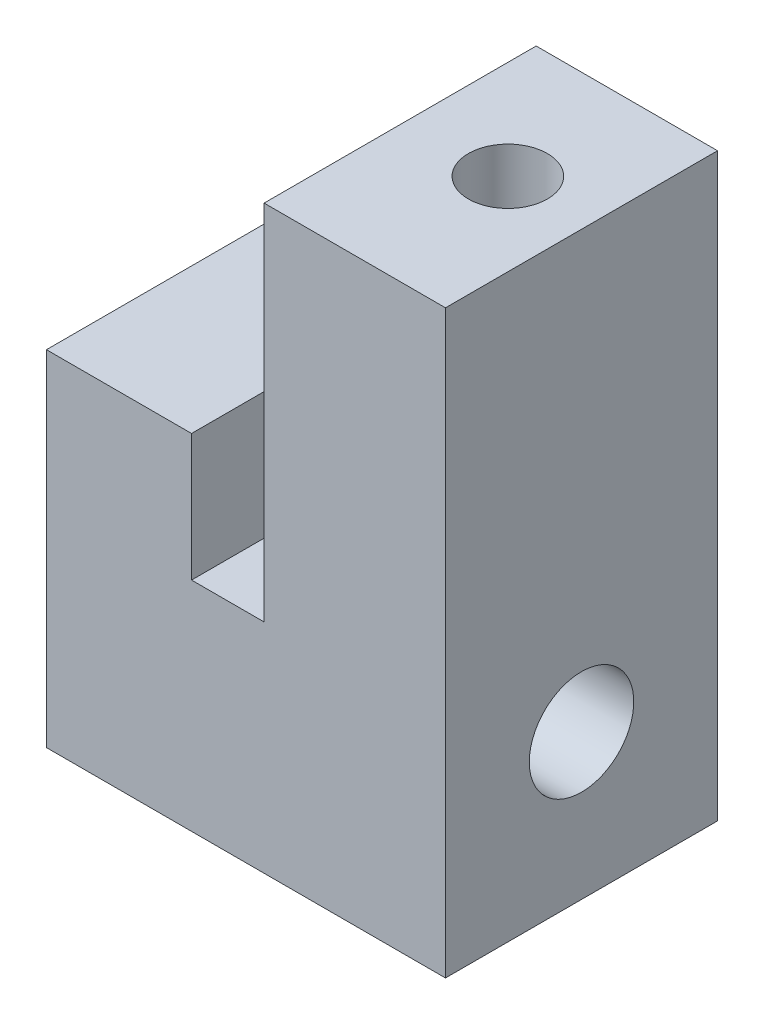
ISO-10303-21;
HEADER;
FILE_DESCRIPTION(('STEP AP214'),'2;1');
FILE_NAME('part.step','',(''),(''),'','','');
FILE_SCHEMA(('AUTOMOTIVE_DESIGN { 1 0 10303 214 1 1 1 1 }'));
ENDSEC;
DATA;
#1=APPLICATION_CONTEXT('core data for automotive mechanical design processes');
#2=APPLICATION_PROTOCOL_DEFINITION('international standard','automotive_design',2000,#1);
#3=PRODUCT_CONTEXT('',#1,'mechanical');
#4=PRODUCT('Part','Part','',(#3));
#5=PRODUCT_RELATED_PRODUCT_CATEGORY('part','',(#4));
#6=PRODUCT_DEFINITION_FORMATION('','',#4);
#7=PRODUCT_DEFINITION_CONTEXT('part definition',#1,'design');
#8=PRODUCT_DEFINITION('design','',#6,#7);
#9=PRODUCT_DEFINITION_SHAPE('','',#8);
#10=(LENGTH_UNIT() NAMED_UNIT(*) SI_UNIT(.MILLI.,.METRE.));
#11=(NAMED_UNIT(*) PLANE_ANGLE_UNIT() SI_UNIT($,.RADIAN.));
#12=(NAMED_UNIT(*) SI_UNIT($,.STERADIAN.) SOLID_ANGLE_UNIT());
#13=UNCERTAINTY_MEASURE_WITH_UNIT(LENGTH_MEASURE(1.E-05),#10,'distance_accuracy_value','');
#14=(GEOMETRIC_REPRESENTATION_CONTEXT(3) GLOBAL_UNCERTAINTY_ASSIGNED_CONTEXT((#13)) GLOBAL_UNIT_ASSIGNED_CONTEXT((#10,
#11,#12)) REPRESENTATION_CONTEXT('',''));
#15=CARTESIAN_POINT('',(0.,0.,0.));
#16=DIRECTION('',(0.,0.,1.));
#17=DIRECTION('',(1.,0.,0.));
#18=AXIS2_PLACEMENT_3D('',#15,#16,#17);
#19=CARTESIAN_POINT('',(0.,25.4,0.));
#20=DIRECTION('',(1.,0.,0.));
#21=DIRECTION('',(0.,0.,-1.));
#22=AXIS2_PLACEMENT_3D('',#19,#20,#21);
#23=PLANE('',#22);
#24=CARTESIAN_POINT('',(0.,6.35,-5.953125));
#25=DIRECTION('',(-1.,0.,0.));
#26=DIRECTION('',(0.,0.,1.));
#27=AXIS2_PLACEMENT_3D('',#24,#25,#26);
#28=CIRCLE('',#27,2.286);
#29=CARTESIAN_POINT('',(0.,6.35,-3.667125));
#30=VERTEX_POINT('',#29);
#31=EDGE_CURVE('E182',#30,#30,#28,.T.);
#32=ORIENTED_EDGE('',*,*,#31,.F.);
#33=EDGE_LOOP('',(#32));
#34=FACE_BOUND('',#33,.T.);
#35=DIRECTION('',(0.,-1.,0.));
#36=VECTOR('',#35,1.);
#37=CARTESIAN_POINT('',(0.,25.4,0.));
#38=LINE('',#37,#36);
#39=CARTESIAN_POINT('',(0.,15.08125,0.));
#40=VERTEX_POINT('',#39);
#41=CARTESIAN_POINT('',(0.,0.,0.));
#42=VERTEX_POINT('',#41);
#43=EDGE_CURVE('E117',#40,#42,#38,.T.);
#44=ORIENTED_EDGE('',*,*,#43,.F.);
#45=DIRECTION('',(0.,0.,1.));
#46=VECTOR('',#45,1.);
#47=CARTESIAN_POINT('',(0.,15.08125,-25.4));
#48=LINE('',#47,#46);
#49=CARTESIAN_POINT('',(0.,15.08125,-11.90625));
#50=VERTEX_POINT('',#49);
#51=EDGE_CURVE('E86',#50,#40,#48,.T.);
#52=ORIENTED_EDGE('',*,*,#51,.F.);
#53=DIRECTION('',(0.,-1.,0.));
#54=VECTOR('',#53,1.);
#55=CARTESIAN_POINT('',(0.,25.4,-11.90625));
#56=LINE('',#55,#54);
#57=CARTESIAN_POINT('',(0.,0.,-11.90625));
#58=VERTEX_POINT('',#57);
#59=EDGE_CURVE('E79',#50,#58,#56,.T.);
#60=ORIENTED_EDGE('',*,*,#59,.T.);
#61=DIRECTION('',(0.,0.,1.));
#62=VECTOR('',#61,1.);
#63=CARTESIAN_POINT('',(0.,0.,0.));
#64=LINE('',#63,#62);
#65=EDGE_CURVE('E83',#58,#42,#64,.T.);
#66=ORIENTED_EDGE('',*,*,#65,.T.);
#67=EDGE_LOOP('',(#44,#52,#60,#66));
#68=FACE_BOUND('',#67,.T.);
#69=ADVANCED_FACE('F35',(#34,#68),#23,.F.);
#70=CARTESIAN_POINT('',(0.,25.4,0.));
#71=DIRECTION('',(0.,0.,-1.));
#72=DIRECTION('',(-1.,0.,0.));
#73=AXIS2_PLACEMENT_3D('',#70,#71,#72);
#74=PLANE('',#73);
#75=DIRECTION('',(0.,-1.,0.));
#76=VECTOR('',#75,1.);
#77=CARTESIAN_POINT('',(6.35,0.,0.));
#78=LINE('',#77,#76);
#79=CARTESIAN_POINT('',(6.35,15.08125,0.));
#80=VERTEX_POINT('',#79);
#81=CARTESIAN_POINT('',(6.35,9.525,0.));
#82=VERTEX_POINT('',#81);
#83=EDGE_CURVE('E148',#80,#82,#78,.T.);
#84=ORIENTED_EDGE('',*,*,#83,.F.);
#85=DIRECTION('',(1.,0.,0.));
#86=VECTOR('',#85,1.);
#87=CARTESIAN_POINT('',(0.,15.08125,0.));
#88=LINE('',#87,#86);
#89=EDGE_CURVE('E190',#40,#80,#88,.T.);
#90=ORIENTED_EDGE('',*,*,#89,.F.);
#91=ORIENTED_EDGE('',*,*,#43,.T.);
#92=DIRECTION('',(1.,0.,0.));
#93=VECTOR('',#92,1.);
#94=CARTESIAN_POINT('',(0.,0.,0.));
#95=LINE('',#94,#93);
#96=CARTESIAN_POINT('',(17.4625,0.,0.));
#97=VERTEX_POINT('',#96);
#98=EDGE_CURVE('E103',#42,#97,#95,.T.);
#99=ORIENTED_EDGE('',*,*,#98,.T.);
#100=DIRECTION('',(0.,-1.,0.));
#101=VECTOR('',#100,1.);
#102=CARTESIAN_POINT('',(17.4625,25.4,0.));
#103=LINE('',#102,#101);
#104=CARTESIAN_POINT('',(17.4625,25.4,0.));
#105=VERTEX_POINT('',#104);
#106=EDGE_CURVE('E114',#105,#97,#103,.T.);
#107=ORIENTED_EDGE('',*,*,#106,.F.);
#108=DIRECTION('',(1.,0.,0.));
#109=VECTOR('',#108,1.);
#110=CARTESIAN_POINT('',(0.,25.4,0.));
#111=LINE('',#110,#109);
#112=CARTESIAN_POINT('',(9.525,25.4,0.));
#113=VERTEX_POINT('',#112);
#114=EDGE_CURVE('E98',#113,#105,#111,.T.);
#115=ORIENTED_EDGE('',*,*,#114,.F.);
#116=DIRECTION('',(0.,1.,0.));
#117=VECTOR('',#116,1.);
#118=CARTESIAN_POINT('',(9.525,0.,0.));
#119=LINE('',#118,#117);
#120=CARTESIAN_POINT('',(9.525,9.525,0.));
#121=VERTEX_POINT('',#120);
#122=EDGE_CURVE('E50',#121,#113,#119,.T.);
#123=ORIENTED_EDGE('',*,*,#122,.F.);
#124=DIRECTION('',(1.,0.,0.));
#125=VECTOR('',#124,1.);
#126=CARTESIAN_POINT('',(0.,9.525,0.));
#127=LINE('',#126,#125);
#128=EDGE_CURVE('E194',#82,#121,#127,.T.);
#129=ORIENTED_EDGE('',*,*,#128,.F.);
#130=EDGE_LOOP('',(#84,#90,#91,#99,#107,#115,#123,#129));
#131=FACE_BOUND('',#130,.T.);
#132=ADVANCED_FACE('F200',(#131),#74,.F.);
#133=CARTESIAN_POINT('',(17.4625,25.4,0.));
#134=DIRECTION('',(-1.,0.,0.));
#135=DIRECTION('',(0.,0.,1.));
#136=AXIS2_PLACEMENT_3D('',#133,#134,#135);
#137=PLANE('',#136);
#138=CARTESIAN_POINT('',(17.4625,6.35,-5.953125));
#139=DIRECTION('',(-1.,0.,0.));
#140=DIRECTION('',(0.,0.,1.));
#141=AXIS2_PLACEMENT_3D('',#138,#139,#140);
#142=CIRCLE('',#141,2.286);
#143=CARTESIAN_POINT('',(17.4625,6.35,-3.667125));
#144=VERTEX_POINT('',#143);
#145=EDGE_CURVE('E38',#144,#144,#142,.T.);
#146=ORIENTED_EDGE('',*,*,#145,.T.);
#147=EDGE_LOOP('',(#146));
#148=FACE_BOUND('',#147,.T.);
#149=DIRECTION('',(0.,0.,-1.));
#150=VECTOR('',#149,1.);
#151=CARTESIAN_POINT('',(17.4625,0.,0.));
#152=LINE('',#151,#150);
#153=CARTESIAN_POINT('',(17.4625,0.,-11.90625));
#154=VERTEX_POINT('',#153);
#155=EDGE_CURVE('E99',#97,#154,#152,.T.);
#156=ORIENTED_EDGE('',*,*,#155,.T.);
#157=DIRECTION('',(0.,-1.,0.));
#158=VECTOR('',#157,1.);
#159=CARTESIAN_POINT('',(17.4625,25.4,-11.90625));
#160=LINE('',#159,#158);
#161=CARTESIAN_POINT('',(17.4625,25.4,-11.90625));
#162=VERTEX_POINT('',#161);
#163=EDGE_CURVE('E88',#162,#154,#160,.T.);
#164=ORIENTED_EDGE('',*,*,#163,.F.);
#165=DIRECTION('',(0.,0.,-1.));
#166=VECTOR('',#165,1.);
#167=CARTESIAN_POINT('',(17.4625,25.4,0.));
#168=LINE('',#167,#166);
#169=EDGE_CURVE('E59',#105,#162,#168,.T.);
#170=ORIENTED_EDGE('',*,*,#169,.F.);
#171=ORIENTED_EDGE('',*,*,#106,.T.);
#172=EDGE_LOOP('',(#156,#164,#170,#171));
#173=FACE_BOUND('',#172,.T.);
#174=ADVANCED_FACE('F203',(#148,#173),#137,.F.);
#175=CARTESIAN_POINT('',(0.,25.4,-11.90625));
#176=DIRECTION('',(0.,0.,1.));
#177=DIRECTION('',(1.,0.,0.));
#178=AXIS2_PLACEMENT_3D('',#175,#176,#177);
#179=PLANE('',#178);
#180=ORIENTED_EDGE('',*,*,#59,.F.);
#181=DIRECTION('',(1.,0.,0.));
#182=VECTOR('',#181,1.);
#183=CARTESIAN_POINT('',(0.,15.08125,-11.90625));
#184=LINE('',#183,#182);
#185=CARTESIAN_POINT('',(6.35,15.08125,-11.90625));
#186=VERTEX_POINT('',#185);
#187=EDGE_CURVE('E11',#50,#186,#184,.T.);
#188=ORIENTED_EDGE('',*,*,#187,.T.);
#189=DIRECTION('',(0.,-1.,0.));
#190=VECTOR('',#189,1.);
#191=CARTESIAN_POINT('',(6.35,25.4,-11.90625));
#192=LINE('',#191,#190);
#193=CARTESIAN_POINT('',(6.35,9.525,-11.90625));
#194=VERTEX_POINT('',#193);
#195=EDGE_CURVE('E121',#186,#194,#192,.T.);
#196=ORIENTED_EDGE('',*,*,#195,.T.);
#197=DIRECTION('',(1.,0.,0.));
#198=VECTOR('',#197,1.);
#199=CARTESIAN_POINT('',(0.,9.525,-11.90625));
#200=LINE('',#199,#198);
#201=CARTESIAN_POINT('',(9.525,9.525,-11.90625));
#202=VERTEX_POINT('',#201);
#203=EDGE_CURVE('E43',#194,#202,#200,.T.);
#204=ORIENTED_EDGE('',*,*,#203,.T.);
#205=DIRECTION('',(0.,1.,0.));
#206=VECTOR('',#205,1.);
#207=CARTESIAN_POINT('',(9.525,25.4,-11.90625));
#208=LINE('',#207,#206);
#209=CARTESIAN_POINT('',(9.525,25.4,-11.90625));
#210=VERTEX_POINT('',#209);
#211=EDGE_CURVE('E104',#202,#210,#208,.T.);
#212=ORIENTED_EDGE('',*,*,#211,.T.);
#213=DIRECTION('',(-1.,0.,0.));
#214=VECTOR('',#213,1.);
#215=CARTESIAN_POINT('',(0.,25.4,-11.90625));
#216=LINE('',#215,#214);
#217=EDGE_CURVE('E89',#162,#210,#216,.T.);
#218=ORIENTED_EDGE('',*,*,#217,.F.);
#219=ORIENTED_EDGE('',*,*,#163,.T.);
#220=DIRECTION('',(-1.,0.,0.));
#221=VECTOR('',#220,1.);
#222=CARTESIAN_POINT('',(0.,0.,-11.90625));
#223=LINE('',#222,#221);
#224=EDGE_CURVE('E93',#154,#58,#223,.T.);
#225=ORIENTED_EDGE('',*,*,#224,.T.);
#226=EDGE_LOOP('',(#180,#188,#196,#204,#212,#218,#219,#225));
#227=FACE_BOUND('',#226,.T.);
#228=ADVANCED_FACE('F94',(#227),#179,.F.);
#229=CARTESIAN_POINT('',(0.,25.4,0.));
#230=DIRECTION('',(0.,-1.,0.));
#231=DIRECTION('',(0.,0.,-1.));
#232=AXIS2_PLACEMENT_3D('',#229,#230,#231);
#233=PLANE('',#232);
#234=CARTESIAN_POINT('',(13.843,25.4,-6.35));
#235=DIRECTION('',(0.,1.,0.));
#236=DIRECTION('',(0.,0.,1.));
#237=AXIS2_PLACEMENT_3D('',#234,#235,#236);
#238=CIRCLE('',#237,1.7272);
#239=CARTESIAN_POINT('',(13.843,25.4,-4.6228));
#240=VERTEX_POINT('',#239);
#241=EDGE_CURVE('E183',#240,#240,#238,.T.);
#242=ORIENTED_EDGE('',*,*,#241,.F.);
#243=EDGE_LOOP('',(#242));
#244=FACE_BOUND('',#243,.T.);
#245=ORIENTED_EDGE('',*,*,#217,.T.);
#246=DIRECTION('',(0.,0.,1.));
#247=VECTOR('',#246,1.);
#248=CARTESIAN_POINT('',(9.525,25.4,0.));
#249=LINE('',#248,#247);
#250=EDGE_CURVE('E119',#210,#113,#249,.T.);
#251=ORIENTED_EDGE('',*,*,#250,.T.);
#252=ORIENTED_EDGE('',*,*,#114,.T.);
#253=ORIENTED_EDGE('',*,*,#169,.T.);
#254=EDGE_LOOP('',(#245,#251,#252,#253));
#255=FACE_BOUND('',#254,.T.);
#256=ADVANCED_FACE('F156',(#244,#255),#233,.F.);
#257=CARTESIAN_POINT('',(0.,0.,0.));
#258=DIRECTION('',(0.,-1.,0.));
#259=DIRECTION('',(0.,0.,-1.));
#260=AXIS2_PLACEMENT_3D('',#257,#258,#259);
#261=PLANE('',#260);
#262=ORIENTED_EDGE('',*,*,#65,.F.);
#263=ORIENTED_EDGE('',*,*,#224,.F.);
#264=ORIENTED_EDGE('',*,*,#155,.F.);
#265=ORIENTED_EDGE('',*,*,#98,.F.);
#266=EDGE_LOOP('',(#262,#263,#264,#265));
#267=FACE_BOUND('',#266,.T.);
#268=ADVANCED_FACE('F102',(#267),#261,.T.);
#269=CARTESIAN_POINT('',(0.,15.08125,-25.4));
#270=DIRECTION('',(0.,-1.,0.));
#271=DIRECTION('',(0.,0.,-1.));
#272=AXIS2_PLACEMENT_3D('',#269,#270,#271);
#273=PLANE('',#272);
#274=ORIENTED_EDGE('',*,*,#51,.T.);
#275=ORIENTED_EDGE('',*,*,#89,.T.);
#276=DIRECTION('',(0.,0.,1.));
#277=VECTOR('',#276,1.);
#278=CARTESIAN_POINT('',(6.35,15.08125,-25.4));
#279=LINE('',#278,#277);
#280=EDGE_CURVE('E150',#186,#80,#279,.T.);
#281=ORIENTED_EDGE('',*,*,#280,.F.);
#282=ORIENTED_EDGE('',*,*,#187,.F.);
#283=EDGE_LOOP('',(#274,#275,#281,#282));
#284=FACE_BOUND('',#283,.T.);
#285=ADVANCED_FACE('F198',(#284),#273,.F.);
#286=CARTESIAN_POINT('',(0.,9.525,-25.4));
#287=DIRECTION('',(0.,-1.,0.));
#288=DIRECTION('',(0.,0.,-1.));
#289=AXIS2_PLACEMENT_3D('',#286,#287,#288);
#290=PLANE('',#289);
#291=DIRECTION('',(0.,0.,1.));
#292=VECTOR('',#291,1.);
#293=CARTESIAN_POINT('',(6.35,9.525,-25.4));
#294=LINE('',#293,#292);
#295=EDGE_CURVE('E139',#194,#82,#294,.T.);
#296=ORIENTED_EDGE('',*,*,#295,.T.);
#297=ORIENTED_EDGE('',*,*,#128,.T.);
#298=DIRECTION('',(0.,0.,1.));
#299=VECTOR('',#298,1.);
#300=CARTESIAN_POINT('',(9.525,9.525,-25.4));
#301=LINE('',#300,#299);
#302=EDGE_CURVE('E141',#202,#121,#301,.T.);
#303=ORIENTED_EDGE('',*,*,#302,.F.);
#304=ORIENTED_EDGE('',*,*,#203,.F.);
#305=EDGE_LOOP('',(#296,#297,#303,#304));
#306=FACE_BOUND('',#305,.T.);
#307=ADVANCED_FACE('F136',(#306),#290,.F.);
#308=CARTESIAN_POINT('',(6.35,0.,-25.4));
#309=DIRECTION('',(-1.,0.,0.));
#310=DIRECTION('',(0.,0.,1.));
#311=AXIS2_PLACEMENT_3D('',#308,#309,#310);
#312=PLANE('',#311);
#313=ORIENTED_EDGE('',*,*,#280,.T.);
#314=ORIENTED_EDGE('',*,*,#83,.T.);
#315=ORIENTED_EDGE('',*,*,#295,.F.);
#316=ORIENTED_EDGE('',*,*,#195,.F.);
#317=EDGE_LOOP('',(#313,#314,#315,#316));
#318=FACE_BOUND('',#317,.T.);
#319=ADVANCED_FACE('F145',(#318),#312,.F.);
#320=CARTESIAN_POINT('',(9.525,0.,-25.4));
#321=DIRECTION('',(1.,0.,0.));
#322=DIRECTION('',(0.,0.,-1.));
#323=AXIS2_PLACEMENT_3D('',#320,#321,#322);
#324=PLANE('',#323);
#325=ORIENTED_EDGE('',*,*,#302,.T.);
#326=ORIENTED_EDGE('',*,*,#122,.T.);
#327=ORIENTED_EDGE('',*,*,#250,.F.);
#328=ORIENTED_EDGE('',*,*,#211,.F.);
#329=EDGE_LOOP('',(#325,#326,#327,#328));
#330=FACE_BOUND('',#329,.T.);
#331=ADVANCED_FACE('F221',(#330),#324,.F.);
#332=CARTESIAN_POINT('',(25.4,6.35,-5.953125));
#333=DIRECTION('',(-1.,0.,0.));
#334=DIRECTION('',(0.,0.,1.));
#335=AXIS2_PLACEMENT_3D('',#332,#333,#334);
#336=CYLINDRICAL_SURFACE('',#335,2.286);
#337=ORIENTED_EDGE('',*,*,#31,.T.);
#338=EDGE_LOOP('',(#337));
#339=FACE_BOUND('',#338,.T.);
#340=ORIENTED_EDGE('',*,*,#145,.F.);
#341=EDGE_LOOP('',(#340));
#342=FACE_BOUND('',#341,.T.);
#343=ADVANCED_FACE('F176',(#339,#342),#336,.F.);
#344=CARTESIAN_POINT('',(13.843,14.2875,-6.35));
#345=DIRECTION('',(0.,1.,0.));
#346=DIRECTION('',(0.,0.,1.));
#347=AXIS2_PLACEMENT_3D('',#344,#345,#346);
#348=CONICAL_SURFACE('',#347,1.7272,1.02974425867665);
#349=CARTESIAN_POINT('',(13.843,13.2496935388156,-6.35));
#350=VERTEX_POINT('',#349);
#351=VERTEX_LOOP('',#350);
#352=FACE_BOUND('',#351,.T.);
#353=CARTESIAN_POINT('',(13.843,14.2875,-6.35));
#354=DIRECTION('',(0.,1.,0.));
#355=DIRECTION('',(0.,0.,1.));
#356=AXIS2_PLACEMENT_3D('',#353,#354,#355);
#357=CIRCLE('',#356,1.7272);
#358=CARTESIAN_POINT('',(13.843,14.2875,-4.6228));
#359=VERTEX_POINT('',#358);
#360=EDGE_CURVE('E180',#359,#359,#357,.T.);
#361=ORIENTED_EDGE('',*,*,#360,.T.);
#362=EDGE_LOOP('',(#361));
#363=FACE_BOUND('',#362,.T.);
#364=ADVANCED_FACE('F172',(#352,#363),#348,.F.);
#365=CARTESIAN_POINT('',(13.843,25.4,-6.35));
#366=DIRECTION('',(0.,1.,0.));
#367=DIRECTION('',(0.,0.,1.));
#368=AXIS2_PLACEMENT_3D('',#365,#366,#367);
#369=CYLINDRICAL_SURFACE('',#368,1.7272);
#370=ORIENTED_EDGE('',*,*,#360,.F.);
#371=EDGE_LOOP('',(#370));
#372=FACE_BOUND('',#371,.T.);
#373=ORIENTED_EDGE('',*,*,#241,.T.);
#374=EDGE_LOOP('',(#373));
#375=FACE_BOUND('',#374,.T.);
#376=ADVANCED_FACE('F175',(#372,#375),#369,.F.);
#377=CLOSED_SHELL('',(#69,#132,#174,#228,#256,#268,#285,#307,#319,#331,#343,#364,#376));
#378=MANIFOLD_SOLID_BREP('B2',#377);
#379=ADVANCED_BREP_SHAPE_REPRESENTATION('',(#18,#378),#14);
#380=SHAPE_DEFINITION_REPRESENTATION(#9,#379);
ENDSEC;
END-ISO-10303-21;
